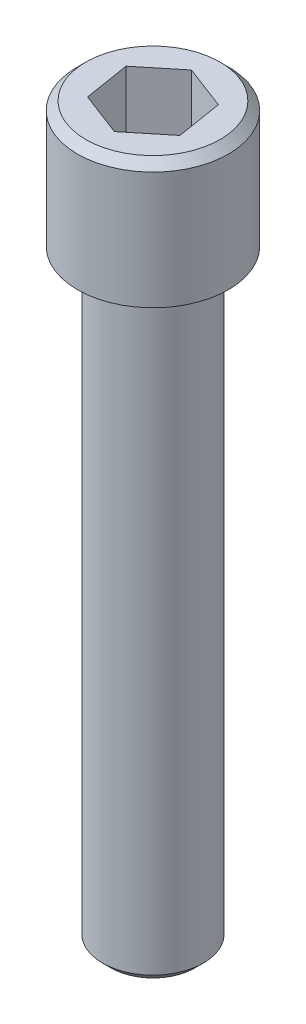
ISO-10303-21;
HEADER;
FILE_DESCRIPTION(('STEP AP214'),'2;1');
FILE_NAME('part.step','',(''),(''),'','','');
FILE_SCHEMA(('AUTOMOTIVE_DESIGN { 1 0 10303 214 1 1 1 1 }'));
ENDSEC;
DATA;
#1=APPLICATION_CONTEXT('core data for automotive mechanical design processes');
#2=APPLICATION_PROTOCOL_DEFINITION('international standard','automotive_design',2000,#1);
#3=PRODUCT_CONTEXT('',#1,'mechanical');
#4=PRODUCT('Part','Part','',(#3));
#5=PRODUCT_RELATED_PRODUCT_CATEGORY('part','',(#4));
#6=PRODUCT_DEFINITION_FORMATION('','',#4);
#7=PRODUCT_DEFINITION_CONTEXT('part definition',#1,'design');
#8=PRODUCT_DEFINITION('design','',#6,#7);
#9=PRODUCT_DEFINITION_SHAPE('','',#8);
#10=(LENGTH_UNIT() NAMED_UNIT(*) SI_UNIT(.MILLI.,.METRE.));
#11=(NAMED_UNIT(*) PLANE_ANGLE_UNIT() SI_UNIT($,.RADIAN.));
#12=(NAMED_UNIT(*) SI_UNIT($,.STERADIAN.) SOLID_ANGLE_UNIT());
#13=UNCERTAINTY_MEASURE_WITH_UNIT(LENGTH_MEASURE(1.E-05),#10,'distance_accuracy_value','');
#14=(GEOMETRIC_REPRESENTATION_CONTEXT(3) GLOBAL_UNCERTAINTY_ASSIGNED_CONTEXT((#13)) GLOBAL_UNIT_ASSIGNED_CONTEXT((#10,
#11,#12)) REPRESENTATION_CONTEXT('',''));
#15=CARTESIAN_POINT('',(0.,0.,0.));
#16=DIRECTION('',(0.,0.,1.));
#17=DIRECTION('',(1.,0.,0.));
#18=AXIS2_PLACEMENT_3D('',#15,#16,#17);
#19=CARTESIAN_POINT('',(0.,18.,0.));
#20=DIRECTION('',(0.,-1.,0.));
#21=DIRECTION('',(0.,0.,-1.));
#22=AXIS2_PLACEMENT_3D('',#19,#20,#21);
#23=CYLINDRICAL_SURFACE('',#22,1.5);
#24=CARTESIAN_POINT('',(0.,0.25,0.));
#25=DIRECTION('',(0.,1.,0.));
#26=DIRECTION('',(0.,0.,1.));
#27=AXIS2_PLACEMENT_3D('',#24,#25,#26);
#28=CIRCLE('',#27,1.5);
#29=CARTESIAN_POINT('',(0.,0.25,1.5));
#30=VERTEX_POINT('',#29);
#31=EDGE_CURVE('E41',#30,#30,#28,.T.);
#32=ORIENTED_EDGE('',*,*,#31,.T.);
#33=EDGE_LOOP('',(#32));
#34=FACE_BOUND('',#33,.T.);
#35=CARTESIAN_POINT('',(0.,18.,0.));
#36=DIRECTION('',(0.,1.,0.));
#37=DIRECTION('',(0.,0.,1.));
#38=AXIS2_PLACEMENT_3D('',#35,#36,#37);
#39=CIRCLE('',#38,1.5);
#40=CARTESIAN_POINT('',(0.,18.,1.5));
#41=VERTEX_POINT('',#40);
#42=EDGE_CURVE('E143',#41,#41,#39,.T.);
#43=ORIENTED_EDGE('',*,*,#42,.F.);
#44=EDGE_LOOP('',(#43));
#45=FACE_BOUND('',#44,.T.);
#46=ADVANCED_FACE('F33',(#34,#45),#23,.T.);
#47=CARTESIAN_POINT('',(0.,0.,0.));
#48=DIRECTION('',(0.,1.,0.));
#49=DIRECTION('',(0.,0.,1.));
#50=AXIS2_PLACEMENT_3D('',#47,#48,#49);
#51=PLANE('',#50);
#52=CARTESIAN_POINT('',(0.,0.,0.));
#53=DIRECTION('',(0.,1.,0.));
#54=DIRECTION('',(0.,0.,1.));
#55=AXIS2_PLACEMENT_3D('',#52,#53,#54);
#56=CIRCLE('',#55,1.25);
#57=CARTESIAN_POINT('',(0.,0.,1.25));
#58=VERTEX_POINT('',#57);
#59=EDGE_CURVE('E11',#58,#58,#56,.F.);
#60=ORIENTED_EDGE('',*,*,#59,.T.);
#61=EDGE_LOOP('',(#60));
#62=FACE_BOUND('',#61,.T.);
#63=ADVANCED_FACE('F165',(#62),#51,.F.);
#64=CARTESIAN_POINT('',(0.,21.75,0.));
#65=DIRECTION('',(0.,-1.,0.));
#66=DIRECTION('',(0.,0.,-1.));
#67=AXIS2_PLACEMENT_3D('',#64,#65,#66);
#68=CYLINDRICAL_SURFACE('',#67,2.25);
#69=CARTESIAN_POINT('',(0.,21.5,0.));
#70=DIRECTION('',(0.,1.,0.));
#71=DIRECTION('',(0.,0.,1.));
#72=AXIS2_PLACEMENT_3D('',#69,#70,#71);
#73=CIRCLE('',#72,2.25);
#74=CARTESIAN_POINT('',(0.,21.5,2.25));
#75=VERTEX_POINT('',#74);
#76=EDGE_CURVE('E149',#75,#75,#73,.F.);
#77=ORIENTED_EDGE('',*,*,#76,.T.);
#78=EDGE_LOOP('',(#77));
#79=FACE_BOUND('',#78,.T.);
#80=CARTESIAN_POINT('',(0.,18.,0.));
#81=DIRECTION('',(0.,1.,0.));
#82=DIRECTION('',(0.,0.,1.));
#83=AXIS2_PLACEMENT_3D('',#80,#81,#82);
#84=CIRCLE('',#83,2.25);
#85=CARTESIAN_POINT('',(0.,18.,2.25));
#86=VERTEX_POINT('',#85);
#87=EDGE_CURVE('E135',#86,#86,#84,.T.);
#88=ORIENTED_EDGE('',*,*,#87,.T.);
#89=EDGE_LOOP('',(#88));
#90=FACE_BOUND('',#89,.T.);
#91=ADVANCED_FACE('F170',(#79,#90),#68,.T.);
#92=CARTESIAN_POINT('',(0.,21.75,0.));
#93=DIRECTION('',(0.,1.,0.));
#94=DIRECTION('',(0.,0.,1.));
#95=AXIS2_PLACEMENT_3D('',#92,#93,#94);
#96=PLANE('',#95);
#97=CARTESIAN_POINT('',(0.,21.75,0.));
#98=DIRECTION('',(0.,1.,0.));
#99=DIRECTION('',(0.,0.,1.));
#100=AXIS2_PLACEMENT_3D('',#97,#98,#99);
#101=CIRCLE('',#100,2.);
#102=CARTESIAN_POINT('',(0.,21.75,2.));
#103=VERTEX_POINT('',#102);
#104=EDGE_CURVE('E146',#103,#103,#101,.T.);
#105=ORIENTED_EDGE('',*,*,#104,.T.);
#106=EDGE_LOOP('',(#105));
#107=FACE_BOUND('',#106,.T.);
#108=DIRECTION('',(0.159195520088402,0.,0.987247074639263));
#109=VECTOR('',#108,1.);
#110=CARTESIAN_POINT('',(-1.2949903812193,21.75,-0.492950213053497));
#111=LINE('',#110,#109);
#112=CARTESIAN_POINT('',(-1.2949903812193,21.75,-0.492950213053497));
#113=VERTEX_POINT('',#112);
#114=CARTESIAN_POINT('',(-1.07440259791493,21.75,0.875019461265662));
#115=VERTEX_POINT('',#114);
#116=EDGE_CURVE('E48',#113,#115,#111,.T.);
#117=ORIENTED_EDGE('',*,*,#116,.F.);
#118=DIRECTION('',(-0.775383286405273,0.,0.631490901884864));
#119=VECTOR('',#118,1.);
#120=CARTESIAN_POINT('',(-0.220587783304371,21.75,-1.36796967431916));
#121=LINE('',#120,#119);
#122=CARTESIAN_POINT('',(-0.220587783304371,21.75,-1.36796967431916));
#123=VERTEX_POINT('',#122);
#124=EDGE_CURVE('E131',#123,#113,#121,.T.);
#125=ORIENTED_EDGE('',*,*,#124,.F.);
#126=DIRECTION('',(-0.934578806493675,0.,-0.3557561727544));
#127=VECTOR('',#126,1.);
#128=CARTESIAN_POINT('',(1.07440259791493,21.75,-0.875019461265662));
#129=LINE('',#128,#127);
#130=CARTESIAN_POINT('',(1.07440259791493,21.75,-0.875019461265662));
#131=VERTEX_POINT('',#130);
#132=EDGE_CURVE('E129',#131,#123,#129,.T.);
#133=ORIENTED_EDGE('',*,*,#132,.F.);
#134=DIRECTION('',(-0.159195520088402,0.,-0.987247074639263));
#135=VECTOR('',#134,1.);
#136=CARTESIAN_POINT('',(1.2949903812193,21.75,0.492950213053496));
#137=LINE('',#136,#135);
#138=CARTESIAN_POINT('',(1.2949903812193,21.75,0.492950213053496));
#139=VERTEX_POINT('',#138);
#140=EDGE_CURVE('E96',#139,#131,#137,.T.);
#141=ORIENTED_EDGE('',*,*,#140,.F.);
#142=DIRECTION('',(0.775383286405273,0.,-0.631490901884864));
#143=VECTOR('',#142,1.);
#144=CARTESIAN_POINT('',(0.220587783304371,21.75,1.36796967431916));
#145=LINE('',#144,#143);
#146=CARTESIAN_POINT('',(0.220587783304371,21.75,1.36796967431916));
#147=VERTEX_POINT('',#146);
#148=EDGE_CURVE('E125',#147,#139,#145,.T.);
#149=ORIENTED_EDGE('',*,*,#148,.F.);
#150=DIRECTION('',(0.934578806493675,0.,0.3557561727544));
#151=VECTOR('',#150,1.);
#152=CARTESIAN_POINT('',(-1.07440259791493,21.75,0.875019461265662));
#153=LINE('',#152,#151);
#154=EDGE_CURVE('E122',#115,#147,#153,.T.);
#155=ORIENTED_EDGE('',*,*,#154,.F.);
#156=EDGE_LOOP('',(#117,#125,#133,#141,#149,#155));
#157=FACE_BOUND('',#156,.T.);
#158=ADVANCED_FACE('F176',(#107,#157),#96,.T.);
#159=CARTESIAN_POINT('',(0.,18.,0.));
#160=DIRECTION('',(0.,1.,0.));
#161=DIRECTION('',(0.,0.,1.));
#162=AXIS2_PLACEMENT_3D('',#159,#160,#161);
#163=PLANE('',#162);
#164=ORIENTED_EDGE('',*,*,#42,.T.);
#165=EDGE_LOOP('',(#164));
#166=FACE_BOUND('',#165,.T.);
#167=ORIENTED_EDGE('',*,*,#87,.F.);
#168=EDGE_LOOP('',(#167));
#169=FACE_BOUND('',#168,.T.);
#170=ADVANCED_FACE('F178',(#166,#169),#163,.F.);
#171=CARTESIAN_POINT('',(-1.2949903812193,19.5,-0.492950213053497));
#172=DIRECTION('',(-0.987247074639263,0.,0.159195520088402));
#173=DIRECTION('',(0.159195520088402,0.,0.987247074639263));
#174=AXIS2_PLACEMENT_3D('',#171,#172,#173);
#175=PLANE('',#174);
#176=ORIENTED_EDGE('',*,*,#116,.T.);
#177=DIRECTION('',(0.,1.,0.));
#178=VECTOR('',#177,1.);
#179=CARTESIAN_POINT('',(-1.07440259791493,19.5,0.875019461265662));
#180=LINE('',#179,#178);
#181=CARTESIAN_POINT('',(-1.07440259791493,19.5,0.875019461265662));
#182=VERTEX_POINT('',#181);
#183=EDGE_CURVE('E78',#182,#115,#180,.T.);
#184=ORIENTED_EDGE('',*,*,#183,.F.);
#185=DIRECTION('',(0.159195520088402,0.,0.987247074639263));
#186=VECTOR('',#185,1.);
#187=CARTESIAN_POINT('',(-1.2949903812193,19.5,-0.492950213053497));
#188=LINE('',#187,#186);
#189=CARTESIAN_POINT('',(-1.2949903812193,19.5,-0.492950213053497));
#190=VERTEX_POINT('',#189);
#191=EDGE_CURVE('E133',#190,#182,#188,.T.);
#192=ORIENTED_EDGE('',*,*,#191,.F.);
#193=DIRECTION('',(0.,1.,0.));
#194=VECTOR('',#193,1.);
#195=CARTESIAN_POINT('',(-1.2949903812193,19.5,-0.492950213053497));
#196=LINE('',#195,#194);
#197=EDGE_CURVE('E56',#190,#113,#196,.T.);
#198=ORIENTED_EDGE('',*,*,#197,.T.);
#199=EDGE_LOOP('',(#176,#184,#192,#198));
#200=FACE_BOUND('',#199,.T.);
#201=ADVANCED_FACE('F181',(#200),#175,.F.);
#202=CARTESIAN_POINT('',(-0.220587783304371,19.5,-1.36796967431916));
#203=DIRECTION('',(-0.631490901884864,0.,-0.775383286405273));
#204=DIRECTION('',(-0.775383286405273,0.,0.631490901884864));
#205=AXIS2_PLACEMENT_3D('',#202,#203,#204);
#206=PLANE('',#205);
#207=ORIENTED_EDGE('',*,*,#124,.T.);
#208=ORIENTED_EDGE('',*,*,#197,.F.);
#209=DIRECTION('',(-0.775383286405273,0.,0.631490901884864));
#210=VECTOR('',#209,1.);
#211=CARTESIAN_POINT('',(-0.220587783304371,19.5,-1.36796967431916));
#212=LINE('',#211,#210);
#213=CARTESIAN_POINT('',(-0.220587783304371,19.5,-1.36796967431916));
#214=VERTEX_POINT('',#213);
#215=EDGE_CURVE('E108',#214,#190,#212,.T.);
#216=ORIENTED_EDGE('',*,*,#215,.F.);
#217=DIRECTION('',(0.,1.,0.));
#218=VECTOR('',#217,1.);
#219=CARTESIAN_POINT('',(-0.220587783304371,19.5,-1.36796967431916));
#220=LINE('',#219,#218);
#221=EDGE_CURVE('E100',#214,#123,#220,.T.);
#222=ORIENTED_EDGE('',*,*,#221,.T.);
#223=EDGE_LOOP('',(#207,#208,#216,#222));
#224=FACE_BOUND('',#223,.T.);
#225=ADVANCED_FACE('F188',(#224),#206,.F.);
#226=CARTESIAN_POINT('',(1.07440259791493,19.5,-0.875019461265662));
#227=DIRECTION('',(0.3557561727544,0.,-0.934578806493675));
#228=DIRECTION('',(-0.934578806493675,0.,-0.3557561727544));
#229=AXIS2_PLACEMENT_3D('',#226,#227,#228);
#230=PLANE('',#229);
#231=ORIENTED_EDGE('',*,*,#132,.T.);
#232=ORIENTED_EDGE('',*,*,#221,.F.);
#233=DIRECTION('',(-0.934578806493675,0.,-0.3557561727544));
#234=VECTOR('',#233,1.);
#235=CARTESIAN_POINT('',(1.07440259791493,19.5,-0.875019461265662));
#236=LINE('',#235,#234);
#237=CARTESIAN_POINT('',(1.07440259791493,19.5,-0.875019461265662));
#238=VERTEX_POINT('',#237);
#239=EDGE_CURVE('E104',#238,#214,#236,.T.);
#240=ORIENTED_EDGE('',*,*,#239,.F.);
#241=DIRECTION('',(0.,1.,0.));
#242=VECTOR('',#241,1.);
#243=CARTESIAN_POINT('',(1.07440259791493,19.5,-0.875019461265662));
#244=LINE('',#243,#242);
#245=EDGE_CURVE('E89',#238,#131,#244,.T.);
#246=ORIENTED_EDGE('',*,*,#245,.T.);
#247=EDGE_LOOP('',(#231,#232,#240,#246));
#248=FACE_BOUND('',#247,.T.);
#249=ADVANCED_FACE('F105',(#248),#230,.F.);
#250=CARTESIAN_POINT('',(1.2949903812193,19.5,0.492950213053496));
#251=DIRECTION('',(0.987247074639263,0.,-0.159195520088402));
#252=DIRECTION('',(-0.159195520088403,0.,-0.987247074639263));
#253=AXIS2_PLACEMENT_3D('',#250,#251,#252);
#254=PLANE('',#253);
#255=ORIENTED_EDGE('',*,*,#140,.T.);
#256=ORIENTED_EDGE('',*,*,#245,.F.);
#257=DIRECTION('',(-0.159195520088402,0.,-0.987247074639263));
#258=VECTOR('',#257,1.);
#259=CARTESIAN_POINT('',(1.2949903812193,19.5,0.492950213053496));
#260=LINE('',#259,#258);
#261=CARTESIAN_POINT('',(1.2949903812193,19.5,0.492950213053496));
#262=VERTEX_POINT('',#261);
#263=EDGE_CURVE('E93',#262,#238,#260,.T.);
#264=ORIENTED_EDGE('',*,*,#263,.F.);
#265=DIRECTION('',(0.,1.,0.));
#266=VECTOR('',#265,1.);
#267=CARTESIAN_POINT('',(1.2949903812193,19.5,0.492950213053496));
#268=LINE('',#267,#266);
#269=EDGE_CURVE('E101',#262,#139,#268,.T.);
#270=ORIENTED_EDGE('',*,*,#269,.T.);
#271=EDGE_LOOP('',(#255,#256,#264,#270));
#272=FACE_BOUND('',#271,.T.);
#273=ADVANCED_FACE('F91',(#272),#254,.F.);
#274=CARTESIAN_POINT('',(0.220587783304371,19.5,1.36796967431916));
#275=DIRECTION('',(0.631490901884864,0.,0.775383286405273));
#276=DIRECTION('',(0.775383286405273,0.,-0.631490901884864));
#277=AXIS2_PLACEMENT_3D('',#274,#275,#276);
#278=PLANE('',#277);
#279=ORIENTED_EDGE('',*,*,#148,.T.);
#280=ORIENTED_EDGE('',*,*,#269,.F.);
#281=DIRECTION('',(0.775383286405273,0.,-0.631490901884864));
#282=VECTOR('',#281,1.);
#283=CARTESIAN_POINT('',(0.220587783304371,19.5,1.36796967431916));
#284=LINE('',#283,#282);
#285=CARTESIAN_POINT('',(0.220587783304371,19.5,1.36796967431916));
#286=VERTEX_POINT('',#285);
#287=EDGE_CURVE('E114',#286,#262,#284,.T.);
#288=ORIENTED_EDGE('',*,*,#287,.F.);
#289=DIRECTION('',(0.,1.,0.));
#290=VECTOR('',#289,1.);
#291=CARTESIAN_POINT('',(0.220587783304371,19.5,1.36796967431916));
#292=LINE('',#291,#290);
#293=EDGE_CURVE('E138',#286,#147,#292,.T.);
#294=ORIENTED_EDGE('',*,*,#293,.T.);
#295=EDGE_LOOP('',(#279,#280,#288,#294));
#296=FACE_BOUND('',#295,.T.);
#297=ADVANCED_FACE('F192',(#296),#278,.F.);
#298=CARTESIAN_POINT('',(-1.07440259791493,19.5,0.875019461265662));
#299=DIRECTION('',(-0.3557561727544,0.,0.934578806493675));
#300=DIRECTION('',(0.934578806493675,0.,0.3557561727544));
#301=AXIS2_PLACEMENT_3D('',#298,#299,#300);
#302=PLANE('',#301);
#303=ORIENTED_EDGE('',*,*,#154,.T.);
#304=ORIENTED_EDGE('',*,*,#293,.F.);
#305=DIRECTION('',(0.934578806493675,0.,0.3557561727544));
#306=VECTOR('',#305,1.);
#307=CARTESIAN_POINT('',(-1.07440259791493,19.5,0.875019461265662));
#308=LINE('',#307,#306);
#309=EDGE_CURVE('E116',#182,#286,#308,.T.);
#310=ORIENTED_EDGE('',*,*,#309,.F.);
#311=ORIENTED_EDGE('',*,*,#183,.T.);
#312=EDGE_LOOP('',(#303,#304,#310,#311));
#313=FACE_BOUND('',#312,.T.);
#314=ADVANCED_FACE('F189',(#313),#302,.F.);
#315=CARTESIAN_POINT('',(0.,19.5,0.));
#316=DIRECTION('',(0.,1.,0.));
#317=DIRECTION('',(0.,0.,1.));
#318=AXIS2_PLACEMENT_3D('',#315,#316,#317);
#319=PLANE('',#318);
#320=ORIENTED_EDGE('',*,*,#191,.T.);
#321=ORIENTED_EDGE('',*,*,#309,.T.);
#322=ORIENTED_EDGE('',*,*,#287,.T.);
#323=ORIENTED_EDGE('',*,*,#263,.T.);
#324=ORIENTED_EDGE('',*,*,#239,.T.);
#325=ORIENTED_EDGE('',*,*,#215,.T.);
#326=EDGE_LOOP('',(#320,#321,#322,#323,#324,#325));
#327=FACE_BOUND('',#326,.T.);
#328=ADVANCED_FACE('F111',(#327),#319,.T.);
#329=CARTESIAN_POINT('',(0.,21.75,0.));
#330=DIRECTION('',(0.,-1.,0.));
#331=DIRECTION('',(0.,0.,-1.));
#332=AXIS2_PLACEMENT_3D('',#329,#330,#331);
#333=CONICAL_SURFACE('',#332,2.,0.785398163397451);
#334=ORIENTED_EDGE('',*,*,#76,.F.);
#335=EDGE_LOOP('',(#334));
#336=FACE_BOUND('',#335,.T.);
#337=ORIENTED_EDGE('',*,*,#104,.F.);
#338=EDGE_LOOP('',(#337));
#339=FACE_BOUND('',#338,.T.);
#340=ADVANCED_FACE('F157',(#336,#339),#333,.T.);
#341=CARTESIAN_POINT('',(0.,0.25,0.));
#342=DIRECTION('',(0.,1.,0.));
#343=DIRECTION('',(0.,0.,1.));
#344=AXIS2_PLACEMENT_3D('',#341,#342,#343);
#345=CONICAL_SURFACE('',#344,1.5,0.785398163397445);
#346=ORIENTED_EDGE('',*,*,#59,.F.);
#347=EDGE_LOOP('',(#346));
#348=FACE_BOUND('',#347,.T.);
#349=ORIENTED_EDGE('',*,*,#31,.F.);
#350=EDGE_LOOP('',(#349));
#351=FACE_BOUND('',#350,.T.);
#352=ADVANCED_FACE('F35',(#348,#351),#345,.T.);
#353=CLOSED_SHELL('',(#46,#63,#91,#158,#170,#201,#225,#249,#273,#297,#314,#328,#340,#352));
#354=MANIFOLD_SOLID_BREP('B2',#353);
#355=ADVANCED_BREP_SHAPE_REPRESENTATION('',(#18,#354),#14);
#356=SHAPE_DEFINITION_REPRESENTATION(#9,#355);
ENDSEC;
END-ISO-10303-21;
